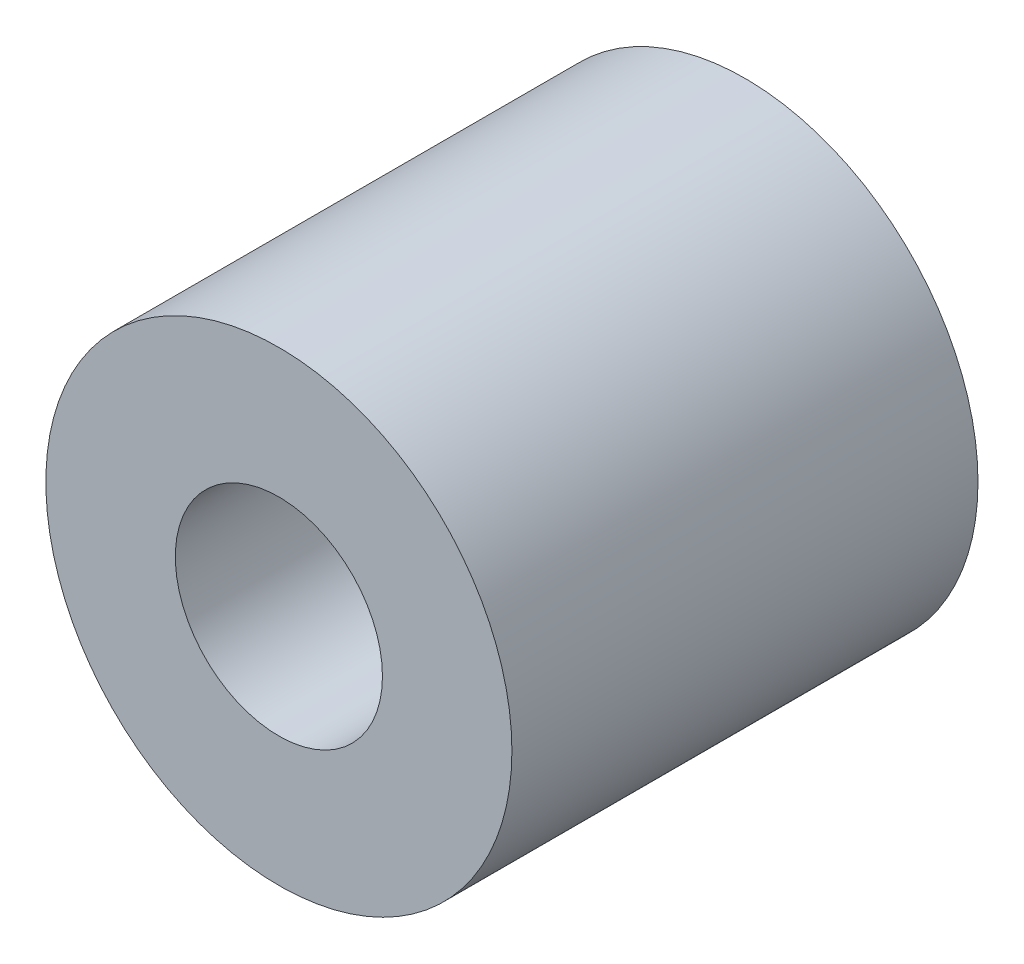
ISO-10303-21;
HEADER;
FILE_DESCRIPTION(('STEP AP214'),'2;1');
FILE_NAME('part.step','',(''),(''),'','','');
FILE_SCHEMA(('AUTOMOTIVE_DESIGN { 1 0 10303 214 1 1 1 1 }'));
ENDSEC;
DATA;
#1=APPLICATION_CONTEXT('core data for automotive mechanical design processes');
#2=APPLICATION_PROTOCOL_DEFINITION('international standard','automotive_design',2000,#1);
#3=PRODUCT_CONTEXT('',#1,'mechanical');
#4=PRODUCT('Part','Part','',(#3));
#5=PRODUCT_RELATED_PRODUCT_CATEGORY('part','',(#4));
#6=PRODUCT_DEFINITION_FORMATION('','',#4);
#7=PRODUCT_DEFINITION_CONTEXT('part definition',#1,'design');
#8=PRODUCT_DEFINITION('design','',#6,#7);
#9=PRODUCT_DEFINITION_SHAPE('','',#8);
#10=(LENGTH_UNIT() NAMED_UNIT(*) SI_UNIT(.MILLI.,.METRE.));
#11=(NAMED_UNIT(*) PLANE_ANGLE_UNIT() SI_UNIT($,.RADIAN.));
#12=(NAMED_UNIT(*) SI_UNIT($,.STERADIAN.) SOLID_ANGLE_UNIT());
#13=UNCERTAINTY_MEASURE_WITH_UNIT(LENGTH_MEASURE(1.E-05),#10,'distance_accuracy_value','');
#14=(GEOMETRIC_REPRESENTATION_CONTEXT(3) GLOBAL_UNCERTAINTY_ASSIGNED_CONTEXT((#13)) GLOBAL_UNIT_ASSIGNED_CONTEXT((#10,
#11,#12)) REPRESENTATION_CONTEXT('',''));
#15=CARTESIAN_POINT('',(0.,0.,0.));
#16=DIRECTION('',(0.,0.,1.));
#17=DIRECTION('',(1.,0.,0.));
#18=AXIS2_PLACEMENT_3D('',#15,#16,#17);
#19=CARTESIAN_POINT('',(0.,0.,9.));
#20=DIRECTION('',(0.,0.,1.));
#21=DIRECTION('',(1.,0.,0.));
#22=AXIS2_PLACEMENT_3D('',#19,#20,#21);
#23=PLANE('',#22);
#24=CARTESIAN_POINT('',(0.,0.,9.));
#25=DIRECTION('',(0.,0.,1.));
#26=DIRECTION('',(1.,0.,0.));
#27=AXIS2_PLACEMENT_3D('',#24,#25,#26);
#28=CIRCLE('',#27,4.5);
#29=CARTESIAN_POINT('',(4.5,0.,9.));
#30=VERTEX_POINT('',#29);
#31=EDGE_CURVE('E10',#30,#30,#28,.T.);
#32=ORIENTED_EDGE('',*,*,#31,.T.);
#33=EDGE_LOOP('',(#32));
#34=FACE_BOUND('',#33,.T.);
#35=CARTESIAN_POINT('',(0.,0.,9.));
#36=DIRECTION('',(0.,0.,1.));
#37=DIRECTION('',(1.,0.,0.));
#38=AXIS2_PLACEMENT_3D('',#35,#36,#37);
#39=CIRCLE('',#38,2.);
#40=CARTESIAN_POINT('',(2.,0.,9.));
#41=VERTEX_POINT('',#40);
#42=EDGE_CURVE('E54',#41,#41,#39,.T.);
#43=ORIENTED_EDGE('',*,*,#42,.F.);
#44=EDGE_LOOP('',(#43));
#45=FACE_BOUND('',#44,.T.);
#46=ADVANCED_FACE('F41',(#34,#45),#23,.T.);
#47=CARTESIAN_POINT('',(0.,0.,0.));
#48=DIRECTION('',(0.,0.,1.));
#49=DIRECTION('',(1.,0.,0.));
#50=AXIS2_PLACEMENT_3D('',#47,#48,#49);
#51=PLANE('',#50);
#52=CARTESIAN_POINT('',(0.,0.,0.));
#53=DIRECTION('',(0.,0.,1.));
#54=DIRECTION('',(1.,0.,0.));
#55=AXIS2_PLACEMENT_3D('',#52,#53,#54);
#56=CIRCLE('',#55,4.5);
#57=CARTESIAN_POINT('',(4.5,0.,0.));
#58=VERTEX_POINT('',#57);
#59=EDGE_CURVE('E45',#58,#58,#56,.T.);
#60=ORIENTED_EDGE('',*,*,#59,.F.);
#61=EDGE_LOOP('',(#60));
#62=FACE_BOUND('',#61,.T.);
#63=CARTESIAN_POINT('',(0.,0.,0.));
#64=DIRECTION('',(0.,0.,1.));
#65=DIRECTION('',(1.,0.,0.));
#66=AXIS2_PLACEMENT_3D('',#63,#64,#65);
#67=CIRCLE('',#66,2.);
#68=CARTESIAN_POINT('',(2.,0.,0.));
#69=VERTEX_POINT('',#68);
#70=EDGE_CURVE('E56',#69,#69,#67,.T.);
#71=ORIENTED_EDGE('',*,*,#70,.T.);
#72=EDGE_LOOP('',(#71));
#73=FACE_BOUND('',#72,.T.);
#74=ADVANCED_FACE('F68',(#62,#73),#51,.F.);
#75=CARTESIAN_POINT('',(0.,0.,9.));
#76=DIRECTION('',(0.,0.,-1.));
#77=DIRECTION('',(-1.,0.,0.));
#78=AXIS2_PLACEMENT_3D('',#75,#76,#77);
#79=CYLINDRICAL_SURFACE('',#78,4.5);
#80=ORIENTED_EDGE('',*,*,#31,.F.);
#81=EDGE_LOOP('',(#80));
#82=FACE_BOUND('',#81,.T.);
#83=ORIENTED_EDGE('',*,*,#59,.T.);
#84=EDGE_LOOP('',(#83));
#85=FACE_BOUND('',#84,.T.);
#86=ADVANCED_FACE('F43',(#82,#85),#79,.T.);
#87=CARTESIAN_POINT('',(0.,0.,9.));
#88=DIRECTION('',(0.,0.,-1.));
#89=DIRECTION('',(-1.,0.,0.));
#90=AXIS2_PLACEMENT_3D('',#87,#88,#89);
#91=CYLINDRICAL_SURFACE('',#90,2.);
#92=ORIENTED_EDGE('',*,*,#42,.T.);
#93=EDGE_LOOP('',(#92));
#94=FACE_BOUND('',#93,.T.);
#95=ORIENTED_EDGE('',*,*,#70,.F.);
#96=EDGE_LOOP('',(#95));
#97=FACE_BOUND('',#96,.T.);
#98=ADVANCED_FACE('F64',(#94,#97),#91,.F.);
#99=CLOSED_SHELL('',(#46,#74,#86,#98));
#100=MANIFOLD_SOLID_BREP('B2',#99);
#101=ADVANCED_BREP_SHAPE_REPRESENTATION('',(#18,#100),#14);
#102=SHAPE_DEFINITION_REPRESENTATION(#9,#101);
ENDSEC;
END-ISO-10303-21;
